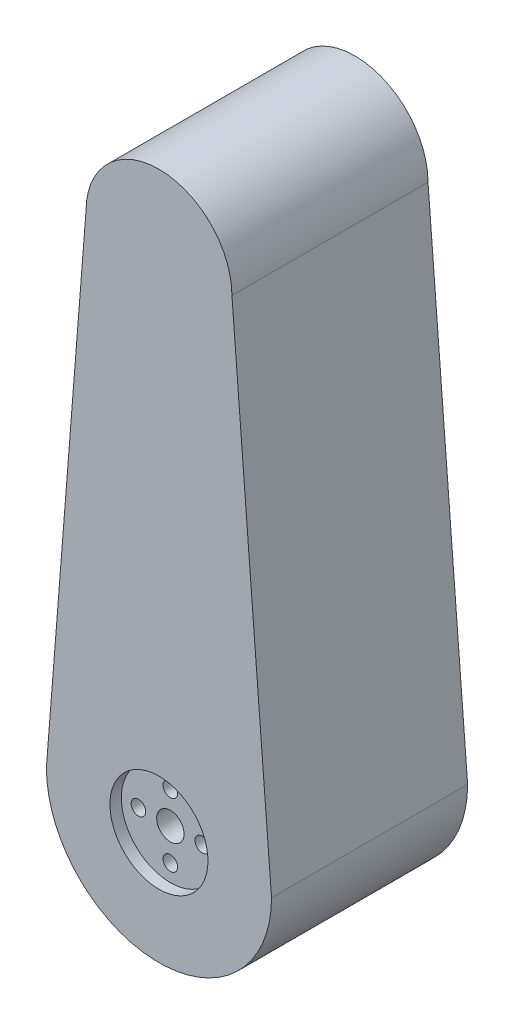
ISO-10303-21;
HEADER;
FILE_DESCRIPTION(('STEP AP214'),'2;1');
FILE_NAME('part.step','',(''),(''),'','','');
FILE_SCHEMA(('AUTOMOTIVE_DESIGN { 1 0 10303 214 1 1 1 1 }'));
ENDSEC;
DATA;
#1=APPLICATION_CONTEXT('core data for automotive mechanical design processes');
#2=APPLICATION_PROTOCOL_DEFINITION('international standard','automotive_design',2000,#1);
#3=PRODUCT_CONTEXT('',#1,'mechanical');
#4=PRODUCT('Part','Part','',(#3));
#5=PRODUCT_RELATED_PRODUCT_CATEGORY('part','',(#4));
#6=PRODUCT_DEFINITION_FORMATION('','',#4);
#7=PRODUCT_DEFINITION_CONTEXT('part definition',#1,'design');
#8=PRODUCT_DEFINITION('design','',#6,#7);
#9=PRODUCT_DEFINITION_SHAPE('','',#8);
#10=(LENGTH_UNIT() NAMED_UNIT(*) SI_UNIT(.MILLI.,.METRE.));
#11=(NAMED_UNIT(*) PLANE_ANGLE_UNIT() SI_UNIT($,.RADIAN.));
#12=(NAMED_UNIT(*) SI_UNIT($,.STERADIAN.) SOLID_ANGLE_UNIT());
#13=UNCERTAINTY_MEASURE_WITH_UNIT(LENGTH_MEASURE(1.E-05),#10,'distance_accuracy_value','');
#14=(GEOMETRIC_REPRESENTATION_CONTEXT(3) GLOBAL_UNCERTAINTY_ASSIGNED_CONTEXT((#13)) GLOBAL_UNIT_ASSIGNED_CONTEXT((#10,
#11,#12)) REPRESENTATION_CONTEXT('',''));
#15=CARTESIAN_POINT('',(0.,0.,0.));
#16=DIRECTION('',(0.,0.,1.));
#17=DIRECTION('',(1.,0.,0.));
#18=AXIS2_PLACEMENT_3D('',#15,#16,#17);
#19=CARTESIAN_POINT('',(0.,110.,21.5));
#20=DIRECTION('',(0.,0.,-1.));
#21=DIRECTION('',(-1.,0.,0.));
#22=AXIS2_PLACEMENT_3D('',#19,#20,#21);
#23=CYLINDRICAL_SURFACE('',#22,16.);
#24=CARTESIAN_POINT('',(0.,110.,-21.5));
#25=DIRECTION('',(0.,0.,1.));
#26=DIRECTION('',(1.,0.,0.));
#27=AXIS2_PLACEMENT_3D('',#24,#25,#26);
#28=CIRCLE('',#27,16.);
#29=CARTESIAN_POINT('',(16.,110.,-21.5));
#30=VERTEX_POINT('',#29);
#31=CARTESIAN_POINT('',(-16.,110.,-21.5));
#32=VERTEX_POINT('',#31);
#33=EDGE_CURVE('E221',#30,#32,#28,.T.);
#34=ORIENTED_EDGE('',*,*,#33,.T.);
#35=DIRECTION('',(0.,0.,-1.));
#36=VECTOR('',#35,1.);
#37=CARTESIAN_POINT('',(-16.,110.,21.5));
#38=LINE('',#37,#36);
#39=CARTESIAN_POINT('',(-16.,110.,21.5));
#40=VERTEX_POINT('',#39);
#41=EDGE_CURVE('E48',#40,#32,#38,.T.);
#42=ORIENTED_EDGE('',*,*,#41,.F.);
#43=CARTESIAN_POINT('',(0.,110.,21.5));
#44=DIRECTION('',(0.,0.,1.));
#45=DIRECTION('',(1.,0.,0.));
#46=AXIS2_PLACEMENT_3D('',#43,#44,#45);
#47=CIRCLE('',#46,16.);
#48=CARTESIAN_POINT('',(16.,110.,21.5));
#49=VERTEX_POINT('',#48);
#50=EDGE_CURVE('E229',#49,#40,#47,.T.);
#51=ORIENTED_EDGE('',*,*,#50,.F.);
#52=DIRECTION('',(0.,0.,-1.));
#53=VECTOR('',#52,1.);
#54=CARTESIAN_POINT('',(16.,110.,21.5));
#55=LINE('',#54,#53);
#56=EDGE_CURVE('E236',#49,#30,#55,.T.);
#57=ORIENTED_EDGE('',*,*,#56,.T.);
#58=EDGE_LOOP('',(#34,#42,#51,#57));
#59=FACE_BOUND('',#58,.T.);
#60=ADVANCED_FACE('F44',(#59),#23,.T.);
#61=CARTESIAN_POINT('',(-24.6859019158233,0.,21.5));
#62=DIRECTION('',(0.99689694588377,-0.078717719019366,0.));
#63=DIRECTION('',(0.078717719019366,0.99689694588377,0.));
#64=AXIS2_PLACEMENT_3D('',#61,#62,#63);
#65=PLANE('',#64);
#66=DIRECTION('',(-0.078717719019366,-0.99689694588377,0.));
#67=VECTOR('',#66,1.);
#68=CARTESIAN_POINT('',(-24.6859019158233,0.,-21.5));
#69=LINE('',#68,#67);
#70=CARTESIAN_POINT('',(-24.6859019158233,0.,-21.5));
#71=VERTEX_POINT('',#70);
#72=EDGE_CURVE('E242',#32,#71,#69,.T.);
#73=ORIENTED_EDGE('',*,*,#72,.T.);
#74=DIRECTION('',(0.,0.,-1.));
#75=VECTOR('',#74,1.);
#76=CARTESIAN_POINT('',(-24.6859019158233,0.,21.5));
#77=LINE('',#76,#75);
#78=CARTESIAN_POINT('',(-24.6859019158233,0.,21.5));
#79=VERTEX_POINT('',#78);
#80=EDGE_CURVE('E255',#79,#71,#77,.T.);
#81=ORIENTED_EDGE('',*,*,#80,.F.);
#82=DIRECTION('',(-0.078717719019366,-0.99689694588377,0.));
#83=VECTOR('',#82,1.);
#84=CARTESIAN_POINT('',(-24.6859019158233,0.,21.5));
#85=LINE('',#84,#83);
#86=EDGE_CURVE('E97',#40,#79,#85,.T.);
#87=ORIENTED_EDGE('',*,*,#86,.F.);
#88=ORIENTED_EDGE('',*,*,#41,.T.);
#89=EDGE_LOOP('',(#73,#81,#87,#88));
#90=FACE_BOUND('',#89,.T.);
#91=ADVANCED_FACE('F265',(#90),#65,.F.);
#92=CARTESIAN_POINT('',(0.,0.,21.5));
#93=DIRECTION('',(0.,0.,-1.));
#94=DIRECTION('',(-1.,0.,0.));
#95=AXIS2_PLACEMENT_3D('',#92,#93,#94);
#96=CYLINDRICAL_SURFACE('',#95,24.6859019158233);
#97=CARTESIAN_POINT('',(0.,0.,-21.5));
#98=DIRECTION('',(0.,0.,1.));
#99=DIRECTION('',(1.,0.,0.));
#100=AXIS2_PLACEMENT_3D('',#97,#98,#99);
#101=CIRCLE('',#100,24.6859019158233);
#102=CARTESIAN_POINT('',(24.6859019158233,0.,-21.5));
#103=VERTEX_POINT('',#102);
#104=EDGE_CURVE('E245',#71,#103,#101,.T.);
#105=ORIENTED_EDGE('',*,*,#104,.T.);
#106=DIRECTION('',(0.,0.,-1.));
#107=VECTOR('',#106,1.);
#108=CARTESIAN_POINT('',(24.6859019158233,0.,21.5));
#109=LINE('',#108,#107);
#110=CARTESIAN_POINT('',(24.6859019158233,0.,21.5));
#111=VERTEX_POINT('',#110);
#112=EDGE_CURVE('E252',#111,#103,#109,.T.);
#113=ORIENTED_EDGE('',*,*,#112,.F.);
#114=CARTESIAN_POINT('',(0.,0.,21.5));
#115=DIRECTION('',(0.,0.,1.));
#116=DIRECTION('',(1.,0.,0.));
#117=AXIS2_PLACEMENT_3D('',#114,#115,#116);
#118=CIRCLE('',#117,24.6859019158233);
#119=EDGE_CURVE('E233',#79,#111,#118,.T.);
#120=ORIENTED_EDGE('',*,*,#119,.F.);
#121=ORIENTED_EDGE('',*,*,#80,.T.);
#122=EDGE_LOOP('',(#105,#113,#120,#121));
#123=FACE_BOUND('',#122,.T.);
#124=ADVANCED_FACE('F267',(#123),#96,.T.);
#125=CARTESIAN_POINT('',(16.,110.,21.5));
#126=DIRECTION('',(-0.99689694588377,-0.078717719019366,0.));
#127=DIRECTION('',(0.078717719019366,-0.99689694588377,0.));
#128=AXIS2_PLACEMENT_3D('',#125,#126,#127);
#129=PLANE('',#128);
#130=DIRECTION('',(-0.078717719019366,0.99689694588377,0.));
#131=VECTOR('',#130,1.);
#132=CARTESIAN_POINT('',(16.,110.,-21.5));
#133=LINE('',#132,#131);
#134=EDGE_CURVE('E93',#103,#30,#133,.T.);
#135=ORIENTED_EDGE('',*,*,#134,.T.);
#136=ORIENTED_EDGE('',*,*,#56,.F.);
#137=DIRECTION('',(-0.078717719019366,0.99689694588377,0.));
#138=VECTOR('',#137,1.);
#139=CARTESIAN_POINT('',(16.,110.,21.5));
#140=LINE('',#139,#138);
#141=EDGE_CURVE('E66',#111,#49,#140,.T.);
#142=ORIENTED_EDGE('',*,*,#141,.F.);
#143=ORIENTED_EDGE('',*,*,#112,.T.);
#144=EDGE_LOOP('',(#135,#136,#142,#143));
#145=FACE_BOUND('',#144,.T.);
#146=ADVANCED_FACE('F269',(#145),#129,.F.);
#147=CARTESIAN_POINT('',(0.,110.,21.5));
#148=DIRECTION('',(0.,0.,1.));
#149=DIRECTION('',(1.,0.,0.));
#150=AXIS2_PLACEMENT_3D('',#147,#148,#149);
#151=PLANE('',#150);
#152=CARTESIAN_POINT('',(0.,0.,21.5));
#153=DIRECTION('',(0.,0.,1.));
#154=DIRECTION('',(1.,0.,0.));
#155=AXIS2_PLACEMENT_3D('',#152,#153,#154);
#156=CIRCLE('',#155,10.75);
#157=CARTESIAN_POINT('',(10.75,0.,21.5));
#158=VERTEX_POINT('',#157);
#159=EDGE_CURVE('E216',#158,#158,#156,.T.);
#160=ORIENTED_EDGE('',*,*,#159,.F.);
#161=EDGE_LOOP('',(#160));
#162=FACE_BOUND('',#161,.T.);
#163=ORIENTED_EDGE('',*,*,#50,.T.);
#164=ORIENTED_EDGE('',*,*,#86,.T.);
#165=ORIENTED_EDGE('',*,*,#119,.T.);
#166=ORIENTED_EDGE('',*,*,#141,.T.);
#167=EDGE_LOOP('',(#163,#164,#165,#166));
#168=FACE_BOUND('',#167,.T.);
#169=ADVANCED_FACE('F271',(#162,#168),#151,.T.);
#170=CARTESIAN_POINT('',(0.,110.,-21.5));
#171=DIRECTION('',(0.,0.,1.));
#172=DIRECTION('',(1.,0.,0.));
#173=AXIS2_PLACEMENT_3D('',#170,#171,#172);
#174=PLANE('',#173);
#175=CARTESIAN_POINT('',(0.,118.6,-21.5));
#176=DIRECTION('',(0.,0.,-1.));
#177=DIRECTION('',(-1.,0.,0.));
#178=AXIS2_PLACEMENT_3D('',#175,#176,#177);
#179=CIRCLE('',#178,1.);
#180=CARTESIAN_POINT('',(-1.,118.6,-21.5));
#181=VERTEX_POINT('',#180);
#182=EDGE_CURVE('E537',#181,#181,#179,.T.);
#183=ORIENTED_EDGE('',*,*,#182,.F.);
#184=EDGE_LOOP('',(#183));
#185=FACE_BOUND('',#184,.T.);
#186=CARTESIAN_POINT('',(0.,89.9,-21.5));
#187=DIRECTION('',(0.,0.,-1.));
#188=DIRECTION('',(-1.,0.,0.));
#189=AXIS2_PLACEMENT_3D('',#186,#187,#188);
#190=CIRCLE('',#189,1.);
#191=CARTESIAN_POINT('',(-1.,89.9,-21.5));
#192=VERTEX_POINT('',#191);
#193=EDGE_CURVE('E543',#192,#192,#190,.T.);
#194=ORIENTED_EDGE('',*,*,#193,.F.);
#195=EDGE_LOOP('',(#194));
#196=FACE_BOUND('',#195,.T.);
#197=DIRECTION('',(-1.,0.,0.));
#198=VECTOR('',#197,1.);
#199=CARTESIAN_POINT('',(6.4,92.5,-21.5));
#200=LINE('',#199,#198);
#201=CARTESIAN_POINT('',(6.4,92.5,-21.5));
#202=VERTEX_POINT('',#201);
#203=CARTESIAN_POINT('',(-6.4,92.5,-21.5));
#204=VERTEX_POINT('',#203);
#205=EDGE_CURVE('E159',#202,#204,#200,.T.);
#206=ORIENTED_EDGE('',*,*,#205,.F.);
#207=DIRECTION('',(0.,-1.,0.));
#208=VECTOR('',#207,1.);
#209=CARTESIAN_POINT('',(6.4,116.,-21.5));
#210=LINE('',#209,#208);
#211=CARTESIAN_POINT('',(6.4,116.,-21.5));
#212=VERTEX_POINT('',#211);
#213=EDGE_CURVE('E61',#212,#202,#210,.T.);
#214=ORIENTED_EDGE('',*,*,#213,.F.);
#215=DIRECTION('',(1.,0.,0.));
#216=VECTOR('',#215,1.);
#217=CARTESIAN_POINT('',(-6.4,116.,-21.5));
#218=LINE('',#217,#216);
#219=CARTESIAN_POINT('',(-6.4,116.,-21.5));
#220=VERTEX_POINT('',#219);
#221=EDGE_CURVE('E145',#220,#212,#218,.T.);
#222=ORIENTED_EDGE('',*,*,#221,.F.);
#223=DIRECTION('',(0.,1.,0.));
#224=VECTOR('',#223,1.);
#225=CARTESIAN_POINT('',(-6.4,116.,-21.5));
#226=LINE('',#225,#224);
#227=EDGE_CURVE('E146',#204,#220,#226,.T.);
#228=ORIENTED_EDGE('',*,*,#227,.F.);
#229=EDGE_LOOP('',(#206,#214,#222,#228));
#230=FACE_BOUND('',#229,.T.);
#231=CARTESIAN_POINT('',(0.,0.,-21.5));
#232=DIRECTION('',(0.,0.,-1.));
#233=DIRECTION('',(-1.,0.,0.));
#234=AXIS2_PLACEMENT_3D('',#231,#232,#233);
#235=CIRCLE('',#234,4.);
#236=CARTESIAN_POINT('',(-4.,0.,-21.5));
#237=VERTEX_POINT('',#236);
#238=EDGE_CURVE('E11',#237,#237,#235,.T.);
#239=ORIENTED_EDGE('',*,*,#238,.F.);
#240=EDGE_LOOP('',(#239));
#241=FACE_BOUND('',#240,.T.);
#242=ORIENTED_EDGE('',*,*,#33,.F.);
#243=ORIENTED_EDGE('',*,*,#134,.F.);
#244=ORIENTED_EDGE('',*,*,#104,.F.);
#245=ORIENTED_EDGE('',*,*,#72,.F.);
#246=EDGE_LOOP('',(#242,#243,#244,#245));
#247=FACE_BOUND('',#246,.T.);
#248=ADVANCED_FACE('F270',(#185,#196,#230,#241,#247),#174,.F.);
#249=CARTESIAN_POINT('',(0.,0.,19.));
#250=DIRECTION('',(0.,0.,1.));
#251=DIRECTION('',(1.,0.,0.));
#252=AXIS2_PLACEMENT_3D('',#249,#250,#251);
#253=CYLINDRICAL_SURFACE('',#252,10.75);
#254=CARTESIAN_POINT('',(0.,0.,19.));
#255=DIRECTION('',(0.,0.,1.));
#256=DIRECTION('',(1.,0.,0.));
#257=AXIS2_PLACEMENT_3D('',#254,#255,#256);
#258=CIRCLE('',#257,10.75);
#259=CARTESIAN_POINT('',(10.75,0.,19.));
#260=VERTEX_POINT('',#259);
#261=EDGE_CURVE('E219',#260,#260,#258,.T.);
#262=ORIENTED_EDGE('',*,*,#261,.F.);
#263=EDGE_LOOP('',(#262));
#264=FACE_BOUND('',#263,.T.);
#265=ORIENTED_EDGE('',*,*,#159,.T.);
#266=EDGE_LOOP('',(#265));
#267=FACE_BOUND('',#266,.T.);
#268=ADVANCED_FACE('F278',(#264,#267),#253,.F.);
#269=CARTESIAN_POINT('',(0.,0.,19.));
#270=DIRECTION('',(0.,0.,1.));
#271=DIRECTION('',(1.,0.,0.));
#272=AXIS2_PLACEMENT_3D('',#269,#270,#271);
#273=PLANE('',#272);
#274=CARTESIAN_POINT('',(0.,7.,19.));
#275=DIRECTION('',(0.,0.,1.));
#276=DIRECTION('',(1.,0.,0.));
#277=AXIS2_PLACEMENT_3D('',#274,#275,#276);
#278=CIRCLE('',#277,1.6);
#279=CARTESIAN_POINT('',(1.6,7.,19.));
#280=VERTEX_POINT('',#279);
#281=EDGE_CURVE('E198',#280,#280,#278,.T.);
#282=ORIENTED_EDGE('',*,*,#281,.F.);
#283=EDGE_LOOP('',(#282));
#284=FACE_BOUND('',#283,.T.);
#285=CARTESIAN_POINT('',(7.,0.,19.));
#286=DIRECTION('',(0.,0.,1.));
#287=DIRECTION('',(1.,0.,0.));
#288=AXIS2_PLACEMENT_3D('',#285,#286,#287);
#289=CIRCLE('',#288,1.6);
#290=CARTESIAN_POINT('',(8.6,0.,19.));
#291=VERTEX_POINT('',#290);
#292=EDGE_CURVE('E202',#291,#291,#289,.T.);
#293=ORIENTED_EDGE('',*,*,#292,.F.);
#294=EDGE_LOOP('',(#293));
#295=FACE_BOUND('',#294,.T.);
#296=CARTESIAN_POINT('',(0.,-7.,19.));
#297=DIRECTION('',(0.,0.,1.));
#298=DIRECTION('',(1.,0.,0.));
#299=AXIS2_PLACEMENT_3D('',#296,#297,#298);
#300=CIRCLE('',#299,1.6);
#301=CARTESIAN_POINT('',(1.59999999999995,-7.,19.));
#302=VERTEX_POINT('',#301);
#303=EDGE_CURVE('E176',#302,#302,#300,.T.);
#304=ORIENTED_EDGE('',*,*,#303,.F.);
#305=EDGE_LOOP('',(#304));
#306=FACE_BOUND('',#305,.T.);
#307=CARTESIAN_POINT('',(-7.,0.,19.));
#308=DIRECTION('',(0.,0.,1.));
#309=DIRECTION('',(1.,0.,0.));
#310=AXIS2_PLACEMENT_3D('',#307,#308,#309);
#311=CIRCLE('',#310,1.6);
#312=CARTESIAN_POINT('',(-5.4,0.,19.));
#313=VERTEX_POINT('',#312);
#314=EDGE_CURVE('E188',#313,#313,#311,.T.);
#315=ORIENTED_EDGE('',*,*,#314,.F.);
#316=EDGE_LOOP('',(#315));
#317=FACE_BOUND('',#316,.T.);
#318=CARTESIAN_POINT('',(0.,0.,19.));
#319=DIRECTION('',(0.,0.,1.));
#320=DIRECTION('',(1.,0.,0.));
#321=AXIS2_PLACEMENT_3D('',#318,#319,#320);
#322=CIRCLE('',#321,3.);
#323=CARTESIAN_POINT('',(3.,0.,19.));
#324=VERTEX_POINT('',#323);
#325=EDGE_CURVE('E199',#324,#324,#322,.T.);
#326=ORIENTED_EDGE('',*,*,#325,.F.);
#327=EDGE_LOOP('',(#326));
#328=FACE_BOUND('',#327,.T.);
#329=ORIENTED_EDGE('',*,*,#261,.T.);
#330=EDGE_LOOP('',(#329));
#331=FACE_BOUND('',#330,.T.);
#332=ADVANCED_FACE('F325',(#284,#295,#306,#317,#328,#331),#273,.T.);
#333=CARTESIAN_POINT('',(0.,0.,9.));
#334=DIRECTION('',(0.,0.,1.));
#335=DIRECTION('',(1.,0.,0.));
#336=AXIS2_PLACEMENT_3D('',#333,#334,#335);
#337=CYLINDRICAL_SURFACE('',#336,3.);
#338=CARTESIAN_POINT('',(0.,0.,9.));
#339=DIRECTION('',(0.,0.,1.));
#340=DIRECTION('',(1.,0.,0.));
#341=AXIS2_PLACEMENT_3D('',#338,#339,#340);
#342=CIRCLE('',#341,3.);
#343=CARTESIAN_POINT('',(3.,0.,9.));
#344=VERTEX_POINT('',#343);
#345=EDGE_CURVE('E215',#344,#344,#342,.T.);
#346=ORIENTED_EDGE('',*,*,#345,.F.);
#347=EDGE_LOOP('',(#346));
#348=FACE_BOUND('',#347,.T.);
#349=ORIENTED_EDGE('',*,*,#325,.T.);
#350=EDGE_LOOP('',(#349));
#351=FACE_BOUND('',#350,.T.);
#352=ADVANCED_FACE('F332',(#348,#351),#337,.F.);
#353=CARTESIAN_POINT('',(0.,0.,9.));
#354=DIRECTION('',(0.,0.,1.));
#355=DIRECTION('',(1.,0.,0.));
#356=AXIS2_PLACEMENT_3D('',#353,#354,#355);
#357=PLANE('',#356);
#358=ORIENTED_EDGE('',*,*,#345,.T.);
#359=EDGE_LOOP('',(#358));
#360=FACE_BOUND('',#359,.T.);
#361=ADVANCED_FACE('F342',(#360),#357,.T.);
#362=CARTESIAN_POINT('',(-7.,0.,9.));
#363=DIRECTION('',(0.,0.,1.));
#364=DIRECTION('',(1.,0.,0.));
#365=AXIS2_PLACEMENT_3D('',#362,#363,#364);
#366=CYLINDRICAL_SURFACE('',#365,1.6);
#367=CARTESIAN_POINT('',(-7.,0.,9.));
#368=DIRECTION('',(0.,0.,1.));
#369=DIRECTION('',(1.,0.,0.));
#370=AXIS2_PLACEMENT_3D('',#367,#368,#369);
#371=CIRCLE('',#370,1.6);
#372=CARTESIAN_POINT('',(-5.4,0.,9.));
#373=VERTEX_POINT('',#372);
#374=EDGE_CURVE('E178',#373,#373,#371,.T.);
#375=ORIENTED_EDGE('',*,*,#374,.F.);
#376=EDGE_LOOP('',(#375));
#377=FACE_BOUND('',#376,.T.);
#378=ORIENTED_EDGE('',*,*,#314,.T.);
#379=EDGE_LOOP('',(#378));
#380=FACE_BOUND('',#379,.T.);
#381=ADVANCED_FACE('F351',(#377,#380),#366,.F.);
#382=CARTESIAN_POINT('',(-7.,0.,9.));
#383=DIRECTION('',(0.,0.,1.));
#384=DIRECTION('',(1.,0.,0.));
#385=AXIS2_PLACEMENT_3D('',#382,#383,#384);
#386=PLANE('',#385);
#387=ORIENTED_EDGE('',*,*,#374,.T.);
#388=EDGE_LOOP('',(#387));
#389=FACE_BOUND('',#388,.T.);
#390=ADVANCED_FACE('F363',(#389),#386,.T.);
#391=CARTESIAN_POINT('',(0.,-7.,9.));
#392=DIRECTION('',(0.,0.,1.));
#393=DIRECTION('',(1.,0.,0.));
#394=AXIS2_PLACEMENT_3D('',#391,#392,#393);
#395=CYLINDRICAL_SURFACE('',#394,1.6);
#396=CARTESIAN_POINT('',(0.,-7.,9.));
#397=DIRECTION('',(0.,0.,1.));
#398=DIRECTION('',(1.,0.,0.));
#399=AXIS2_PLACEMENT_3D('',#396,#397,#398);
#400=CIRCLE('',#399,1.6);
#401=CARTESIAN_POINT('',(1.59999999999995,-7.,9.));
#402=VERTEX_POINT('',#401);
#403=EDGE_CURVE('E183',#402,#402,#400,.T.);
#404=ORIENTED_EDGE('',*,*,#403,.F.);
#405=EDGE_LOOP('',(#404));
#406=FACE_BOUND('',#405,.T.);
#407=ORIENTED_EDGE('',*,*,#303,.T.);
#408=EDGE_LOOP('',(#407));
#409=FACE_BOUND('',#408,.T.);
#410=ADVANCED_FACE('F371',(#406,#409),#395,.F.);
#411=CARTESIAN_POINT('',(0.,-7.,9.));
#412=DIRECTION('',(0.,0.,1.));
#413=DIRECTION('',(1.,0.,0.));
#414=AXIS2_PLACEMENT_3D('',#411,#412,#413);
#415=PLANE('',#414);
#416=ORIENTED_EDGE('',*,*,#403,.T.);
#417=EDGE_LOOP('',(#416));
#418=FACE_BOUND('',#417,.T.);
#419=ADVANCED_FACE('F381',(#418),#415,.T.);
#420=CARTESIAN_POINT('',(7.,0.,9.));
#421=DIRECTION('',(0.,0.,1.));
#422=DIRECTION('',(1.,0.,0.));
#423=AXIS2_PLACEMENT_3D('',#420,#421,#422);
#424=CYLINDRICAL_SURFACE('',#423,1.6);
#425=CARTESIAN_POINT('',(7.,0.,9.));
#426=DIRECTION('',(0.,0.,1.));
#427=DIRECTION('',(1.,0.,0.));
#428=AXIS2_PLACEMENT_3D('',#425,#426,#427);
#429=CIRCLE('',#428,1.6);
#430=CARTESIAN_POINT('',(8.6,0.,9.));
#431=VERTEX_POINT('',#430);
#432=EDGE_CURVE('E184',#431,#431,#429,.T.);
#433=ORIENTED_EDGE('',*,*,#432,.F.);
#434=EDGE_LOOP('',(#433));
#435=FACE_BOUND('',#434,.T.);
#436=ORIENTED_EDGE('',*,*,#292,.T.);
#437=EDGE_LOOP('',(#436));
#438=FACE_BOUND('',#437,.T.);
#439=ADVANCED_FACE('F391',(#435,#438),#424,.F.);
#440=CARTESIAN_POINT('',(7.,0.,9.));
#441=DIRECTION('',(0.,0.,1.));
#442=DIRECTION('',(1.,0.,0.));
#443=AXIS2_PLACEMENT_3D('',#440,#441,#442);
#444=PLANE('',#443);
#445=ORIENTED_EDGE('',*,*,#432,.T.);
#446=EDGE_LOOP('',(#445));
#447=FACE_BOUND('',#446,.T.);
#448=ADVANCED_FACE('F402',(#447),#444,.T.);
#449=CARTESIAN_POINT('',(0.,7.,9.));
#450=DIRECTION('',(0.,0.,1.));
#451=DIRECTION('',(1.,0.,0.));
#452=AXIS2_PLACEMENT_3D('',#449,#450,#451);
#453=CYLINDRICAL_SURFACE('',#452,1.6);
#454=CARTESIAN_POINT('',(0.,7.,9.));
#455=DIRECTION('',(0.,0.,1.));
#456=DIRECTION('',(1.,0.,0.));
#457=AXIS2_PLACEMENT_3D('',#454,#455,#456);
#458=CIRCLE('',#457,1.6);
#459=CARTESIAN_POINT('',(1.6,7.,9.));
#460=VERTEX_POINT('',#459);
#461=EDGE_CURVE('E203',#460,#460,#458,.T.);
#462=ORIENTED_EDGE('',*,*,#461,.F.);
#463=EDGE_LOOP('',(#462));
#464=FACE_BOUND('',#463,.T.);
#465=ORIENTED_EDGE('',*,*,#281,.T.);
#466=EDGE_LOOP('',(#465));
#467=FACE_BOUND('',#466,.T.);
#468=ADVANCED_FACE('F412',(#464,#467),#453,.F.);
#469=CARTESIAN_POINT('',(0.,7.,9.));
#470=DIRECTION('',(0.,0.,1.));
#471=DIRECTION('',(1.,0.,0.));
#472=AXIS2_PLACEMENT_3D('',#469,#470,#471);
#473=PLANE('',#472);
#474=ORIENTED_EDGE('',*,*,#461,.T.);
#475=EDGE_LOOP('',(#474));
#476=FACE_BOUND('',#475,.T.);
#477=ADVANCED_FACE('F423',(#476),#473,.T.);
#478=CARTESIAN_POINT('',(0.,0.,-27.5));
#479=DIRECTION('',(0.,0.,1.));
#480=DIRECTION('',(1.,0.,0.));
#481=AXIS2_PLACEMENT_3D('',#478,#479,#480);
#482=CYLINDRICAL_SURFACE('',#481,4.);
#483=CARTESIAN_POINT('',(0.,0.,-27.5));
#484=DIRECTION('',(0.,0.,-1.));
#485=DIRECTION('',(-1.,0.,0.));
#486=AXIS2_PLACEMENT_3D('',#483,#484,#485);
#487=CIRCLE('',#486,4.);
#488=CARTESIAN_POINT('',(-4.,0.,-27.5));
#489=VERTEX_POINT('',#488);
#490=EDGE_CURVE('E168',#489,#489,#487,.T.);
#491=ORIENTED_EDGE('',*,*,#490,.F.);
#492=EDGE_LOOP('',(#491));
#493=FACE_BOUND('',#492,.T.);
#494=ORIENTED_EDGE('',*,*,#238,.T.);
#495=EDGE_LOOP('',(#494));
#496=FACE_BOUND('',#495,.T.);
#497=ADVANCED_FACE('F431',(#493,#496),#482,.T.);
#498=CARTESIAN_POINT('',(0.,0.,-27.5));
#499=DIRECTION('',(0.,0.,-1.));
#500=DIRECTION('',(-1.,0.,0.));
#501=AXIS2_PLACEMENT_3D('',#498,#499,#500);
#502=PLANE('',#501);
#503=ORIENTED_EDGE('',*,*,#490,.T.);
#504=EDGE_LOOP('',(#503));
#505=FACE_BOUND('',#504,.T.);
#506=ADVANCED_FACE('F442',(#505),#502,.T.);
#507=CARTESIAN_POINT('',(6.4,116.,-3.5));
#508=DIRECTION('',(1.,0.,0.));
#509=DIRECTION('',(0.,1.,0.));
#510=AXIS2_PLACEMENT_3D('',#507,#508,#509);
#511=PLANE('',#510);
#512=ORIENTED_EDGE('',*,*,#213,.T.);
#513=DIRECTION('',(0.,0.,-1.));
#514=VECTOR('',#513,1.);
#515=CARTESIAN_POINT('',(6.4,92.5,-3.5));
#516=LINE('',#515,#514);
#517=CARTESIAN_POINT('',(6.4,92.5,-3.5));
#518=VERTEX_POINT('',#517);
#519=EDGE_CURVE('E118',#518,#202,#516,.T.);
#520=ORIENTED_EDGE('',*,*,#519,.F.);
#521=DIRECTION('',(0.,-1.,0.));
#522=VECTOR('',#521,1.);
#523=CARTESIAN_POINT('',(6.4,116.,-3.5));
#524=LINE('',#523,#522);
#525=CARTESIAN_POINT('',(6.4,116.,-3.5));
#526=VERTEX_POINT('',#525);
#527=EDGE_CURVE('E123',#526,#518,#524,.T.);
#528=ORIENTED_EDGE('',*,*,#527,.F.);
#529=DIRECTION('',(0.,0.,-1.));
#530=VECTOR('',#529,1.);
#531=CARTESIAN_POINT('',(6.4,116.,-3.5));
#532=LINE('',#531,#530);
#533=EDGE_CURVE('E170',#526,#212,#532,.T.);
#534=ORIENTED_EDGE('',*,*,#533,.T.);
#535=EDGE_LOOP('',(#512,#520,#528,#534));
#536=FACE_BOUND('',#535,.T.);
#537=ADVANCED_FACE('F122',(#536),#511,.F.);
#538=CARTESIAN_POINT('',(-6.4,116.,-3.5));
#539=DIRECTION('',(0.,1.,0.));
#540=DIRECTION('',(0.,0.,1.));
#541=AXIS2_PLACEMENT_3D('',#538,#539,#540);
#542=PLANE('',#541);
#543=ORIENTED_EDGE('',*,*,#221,.T.);
#544=ORIENTED_EDGE('',*,*,#533,.F.);
#545=DIRECTION('',(1.,0.,0.));
#546=VECTOR('',#545,1.);
#547=CARTESIAN_POINT('',(-6.4,116.,-3.5));
#548=LINE('',#547,#546);
#549=CARTESIAN_POINT('',(-6.4,116.,-3.5));
#550=VERTEX_POINT('',#549);
#551=EDGE_CURVE('E128',#550,#526,#548,.T.);
#552=ORIENTED_EDGE('',*,*,#551,.F.);
#553=DIRECTION('',(0.,0.,-1.));
#554=VECTOR('',#553,1.);
#555=CARTESIAN_POINT('',(-6.4,116.,-3.5));
#556=LINE('',#555,#554);
#557=EDGE_CURVE('E171',#550,#220,#556,.T.);
#558=ORIENTED_EDGE('',*,*,#557,.T.);
#559=EDGE_LOOP('',(#543,#544,#552,#558));
#560=FACE_BOUND('',#559,.T.);
#561=ADVANCED_FACE('F458',(#560),#542,.F.);
#562=CARTESIAN_POINT('',(-6.4,116.,-3.5));
#563=DIRECTION('',(-1.,0.,0.));
#564=DIRECTION('',(0.,-1.,0.));
#565=AXIS2_PLACEMENT_3D('',#562,#563,#564);
#566=PLANE('',#565);
#567=ORIENTED_EDGE('',*,*,#227,.T.);
#568=ORIENTED_EDGE('',*,*,#557,.F.);
#569=DIRECTION('',(0.,1.,0.));
#570=VECTOR('',#569,1.);
#571=CARTESIAN_POINT('',(-6.4,116.,-3.5));
#572=LINE('',#571,#570);
#573=CARTESIAN_POINT('',(-6.4,92.5,-3.5));
#574=VERTEX_POINT('',#573);
#575=EDGE_CURVE('E139',#574,#550,#572,.T.);
#576=ORIENTED_EDGE('',*,*,#575,.F.);
#577=DIRECTION('',(0.,0.,-1.));
#578=VECTOR('',#577,1.);
#579=CARTESIAN_POINT('',(-6.4,92.5,-3.5));
#580=LINE('',#579,#578);
#581=EDGE_CURVE('E129',#574,#204,#580,.T.);
#582=ORIENTED_EDGE('',*,*,#581,.T.);
#583=EDGE_LOOP('',(#567,#568,#576,#582));
#584=FACE_BOUND('',#583,.T.);
#585=ADVANCED_FACE('F469',(#584),#566,.F.);
#586=CARTESIAN_POINT('',(6.4,92.5,-3.5));
#587=DIRECTION('',(0.,-1.,0.));
#588=DIRECTION('',(0.,0.,-1.));
#589=AXIS2_PLACEMENT_3D('',#586,#587,#588);
#590=PLANE('',#589);
#591=ORIENTED_EDGE('',*,*,#205,.T.);
#592=ORIENTED_EDGE('',*,*,#581,.F.);
#593=DIRECTION('',(-1.,0.,0.));
#594=VECTOR('',#593,1.);
#595=CARTESIAN_POINT('',(6.4,92.5,-3.5));
#596=LINE('',#595,#594);
#597=EDGE_CURVE('E134',#518,#574,#596,.T.);
#598=ORIENTED_EDGE('',*,*,#597,.F.);
#599=ORIENTED_EDGE('',*,*,#519,.T.);
#600=EDGE_LOOP('',(#591,#592,#598,#599));
#601=FACE_BOUND('',#600,.T.);
#602=ADVANCED_FACE('F133',(#601),#590,.F.);
#603=CARTESIAN_POINT('',(0.,0.,-3.5));
#604=DIRECTION('',(0.,0.,-1.));
#605=DIRECTION('',(-1.,0.,0.));
#606=AXIS2_PLACEMENT_3D('',#603,#604,#605);
#607=PLANE('',#606);
#608=ORIENTED_EDGE('',*,*,#527,.T.);
#609=ORIENTED_EDGE('',*,*,#597,.T.);
#610=ORIENTED_EDGE('',*,*,#575,.T.);
#611=ORIENTED_EDGE('',*,*,#551,.T.);
#612=EDGE_LOOP('',(#608,#609,#610,#611));
#613=FACE_BOUND('',#612,.T.);
#614=ADVANCED_FACE('F143',(#613),#607,.T.);
#615=CARTESIAN_POINT('',(0.,89.9,-13.5));
#616=DIRECTION('',(0.,0.,-1.));
#617=DIRECTION('',(-1.,0.,0.));
#618=AXIS2_PLACEMENT_3D('',#615,#616,#617);
#619=CYLINDRICAL_SURFACE('',#618,1.);
#620=CARTESIAN_POINT('',(0.,89.9,-13.5));
#621=DIRECTION('',(0.,0.,-1.));
#622=DIRECTION('',(-1.,0.,0.));
#623=AXIS2_PLACEMENT_3D('',#620,#621,#622);
#624=CIRCLE('',#623,1.);
#625=CARTESIAN_POINT('',(-1.,89.9,-13.5));
#626=VERTEX_POINT('',#625);
#627=EDGE_CURVE('E151',#626,#626,#624,.T.);
#628=ORIENTED_EDGE('',*,*,#627,.F.);
#629=EDGE_LOOP('',(#628));
#630=FACE_BOUND('',#629,.T.);
#631=ORIENTED_EDGE('',*,*,#193,.T.);
#632=EDGE_LOOP('',(#631));
#633=FACE_BOUND('',#632,.T.);
#634=ADVANCED_FACE('F494',(#630,#633),#619,.F.);
#635=CARTESIAN_POINT('',(0.,89.9,-13.5));
#636=DIRECTION('',(0.,0.,-1.));
#637=DIRECTION('',(-1.,0.,0.));
#638=AXIS2_PLACEMENT_3D('',#635,#636,#637);
#639=PLANE('',#638);
#640=ORIENTED_EDGE('',*,*,#627,.T.);
#641=EDGE_LOOP('',(#640));
#642=FACE_BOUND('',#641,.T.);
#643=ADVANCED_FACE('F504',(#642),#639,.T.);
#644=CARTESIAN_POINT('',(0.,118.6,-13.5));
#645=DIRECTION('',(0.,0.,-1.));
#646=DIRECTION('',(-1.,0.,0.));
#647=AXIS2_PLACEMENT_3D('',#644,#645,#646);
#648=CYLINDRICAL_SURFACE('',#647,1.);
#649=CARTESIAN_POINT('',(0.,118.6,-13.5));
#650=DIRECTION('',(0.,0.,-1.));
#651=DIRECTION('',(-1.,0.,0.));
#652=AXIS2_PLACEMENT_3D('',#649,#650,#651);
#653=CIRCLE('',#652,1.);
#654=CARTESIAN_POINT('',(-1.,118.6,-13.5));
#655=VERTEX_POINT('',#654);
#656=EDGE_CURVE('E161',#655,#655,#653,.T.);
#657=ORIENTED_EDGE('',*,*,#656,.F.);
#658=EDGE_LOOP('',(#657));
#659=FACE_BOUND('',#658,.T.);
#660=ORIENTED_EDGE('',*,*,#182,.T.);
#661=EDGE_LOOP('',(#660));
#662=FACE_BOUND('',#661,.T.);
#663=ADVANCED_FACE('F511',(#659,#662),#648,.F.);
#664=CARTESIAN_POINT('',(0.,118.6,-13.5));
#665=DIRECTION('',(0.,0.,-1.));
#666=DIRECTION('',(-1.,0.,0.));
#667=AXIS2_PLACEMENT_3D('',#664,#665,#666);
#668=PLANE('',#667);
#669=ORIENTED_EDGE('',*,*,#656,.T.);
#670=EDGE_LOOP('',(#669));
#671=FACE_BOUND('',#670,.T.);
#672=ADVANCED_FACE('F523',(#671),#668,.T.);
#673=CLOSED_SHELL('',(#60,#91,#124,#146,#169,#248,#268,#332,#352,#361,#381,#390,#410,#419,#439,
#448,#468,#477,#497,#506,#537,#561,#585,#602,#614,#634,#643,#663,#672));
#674=MANIFOLD_SOLID_BREP('B2',#673);
#675=ADVANCED_BREP_SHAPE_REPRESENTATION('',(#18,#674),#14);
#676=SHAPE_DEFINITION_REPRESENTATION(#9,#675);
ENDSEC;
END-ISO-10303-21;
